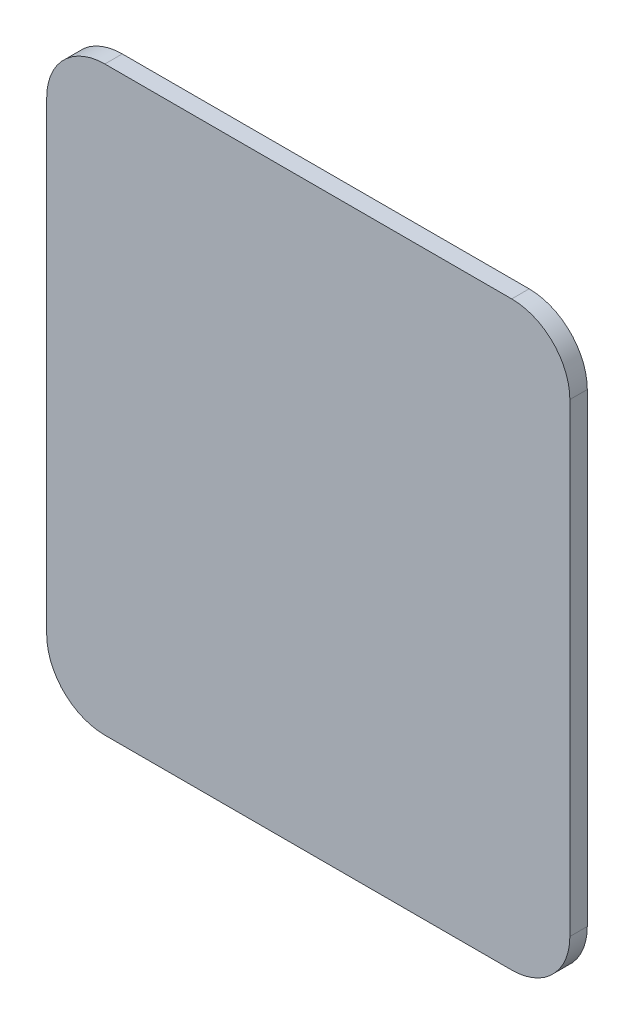
ISO-10303-21;
HEADER;
FILE_DESCRIPTION(('STEP AP214'),'2;1');
FILE_NAME('part.step','',(''),(''),'','','');
FILE_SCHEMA(('AUTOMOTIVE_DESIGN { 1 0 10303 214 1 1 1 1 }'));
ENDSEC;
DATA;
#1=APPLICATION_CONTEXT('core data for automotive mechanical design processes');
#2=APPLICATION_PROTOCOL_DEFINITION('international standard','automotive_design',2000,#1);
#3=PRODUCT_CONTEXT('',#1,'mechanical');
#4=PRODUCT('Part','Part','',(#3));
#5=PRODUCT_RELATED_PRODUCT_CATEGORY('part','',(#4));
#6=PRODUCT_DEFINITION_FORMATION('','',#4);
#7=PRODUCT_DEFINITION_CONTEXT('part definition',#1,'design');
#8=PRODUCT_DEFINITION('design','',#6,#7);
#9=PRODUCT_DEFINITION_SHAPE('','',#8);
#10=(LENGTH_UNIT() NAMED_UNIT(*) SI_UNIT(.MILLI.,.METRE.));
#11=(NAMED_UNIT(*) PLANE_ANGLE_UNIT() SI_UNIT($,.RADIAN.));
#12=(NAMED_UNIT(*) SI_UNIT($,.STERADIAN.) SOLID_ANGLE_UNIT());
#13=UNCERTAINTY_MEASURE_WITH_UNIT(LENGTH_MEASURE(1.E-05),#10,'distance_accuracy_value','');
#14=(GEOMETRIC_REPRESENTATION_CONTEXT(3) GLOBAL_UNCERTAINTY_ASSIGNED_CONTEXT((#13)) GLOBAL_UNIT_ASSIGNED_CONTEXT((#10,
#11,#12)) REPRESENTATION_CONTEXT('',''));
#15=CARTESIAN_POINT('',(0.,0.,0.));
#16=DIRECTION('',(0.,0.,1.));
#17=DIRECTION('',(1.,0.,0.));
#18=AXIS2_PLACEMENT_3D('',#15,#16,#17);
#19=CARTESIAN_POINT('',(53.2129195112654,-70.3373762207558,3.));
#20=DIRECTION('',(0.,0.,1.));
#21=DIRECTION('',(1.,0.,0.));
#22=AXIS2_PLACEMENT_3D('',#19,#20,#21);
#23=CYLINDRICAL_SURFACE('',#22,10.);
#24=DIRECTION('',(0.,0.,1.));
#25=VECTOR('',#24,1.);
#26=CARTESIAN_POINT('',(53.2129195112654,-80.3373762207558,3.));
#27=LINE('',#26,#25);
#28=CARTESIAN_POINT('',(53.2129195112654,-80.3373762207558,0.));
#29=VERTEX_POINT('',#28);
#30=CARTESIAN_POINT('',(53.2129195112654,-80.3373762207558,3.));
#31=VERTEX_POINT('',#30);
#32=EDGE_CURVE('E150',#29,#31,#27,.T.);
#33=ORIENTED_EDGE('',*,*,#32,.F.);
#34=CARTESIAN_POINT('',(53.2129195112654,-70.3373762207558,0.));
#35=DIRECTION('',(0.,0.,1.));
#36=DIRECTION('',(1.,0.,0.));
#37=AXIS2_PLACEMENT_3D('',#34,#35,#36);
#38=CIRCLE('',#37,10.);
#39=CARTESIAN_POINT('',(63.2129195112654,-70.3373762207558,0.));
#40=VERTEX_POINT('',#39);
#41=EDGE_CURVE('E40',#40,#29,#38,.F.);
#42=ORIENTED_EDGE('',*,*,#41,.F.);
#43=DIRECTION('',(0.,0.,1.));
#44=VECTOR('',#43,1.);
#45=CARTESIAN_POINT('',(63.2129195112654,-70.3373762207558,3.));
#46=LINE('',#45,#44);
#47=CARTESIAN_POINT('',(63.2129195112654,-70.3373762207558,3.));
#48=VERTEX_POINT('',#47);
#49=EDGE_CURVE('E153',#48,#40,#46,.F.);
#50=ORIENTED_EDGE('',*,*,#49,.F.);
#51=CARTESIAN_POINT('',(53.2129195112654,-70.3373762207558,3.));
#52=DIRECTION('',(0.,0.,1.));
#53=DIRECTION('',(1.,0.,0.));
#54=AXIS2_PLACEMENT_3D('',#51,#52,#53);
#55=CIRCLE('',#54,10.);
#56=EDGE_CURVE('E11',#31,#48,#55,.T.);
#57=ORIENTED_EDGE('',*,*,#56,.F.);
#58=EDGE_LOOP('',(#33,#42,#50,#57));
#59=FACE_BOUND('',#58,.T.);
#60=ADVANCED_FACE('F33',(#59),#23,.T.);
#61=CARTESIAN_POINT('',(-16.7870804887346,-70.3373762207558,3.));
#62=DIRECTION('',(0.,0.,1.));
#63=DIRECTION('',(1.,0.,0.));
#64=AXIS2_PLACEMENT_3D('',#61,#62,#63);
#65=CYLINDRICAL_SURFACE('',#64,10.);
#66=DIRECTION('',(0.,0.,1.));
#67=VECTOR('',#66,1.);
#68=CARTESIAN_POINT('',(-26.7870804887346,-70.3373762207558,3.));
#69=LINE('',#68,#67);
#70=CARTESIAN_POINT('',(-26.7870804887346,-70.3373762207558,0.));
#71=VERTEX_POINT('',#70);
#72=CARTESIAN_POINT('',(-26.7870804887346,-70.3373762207558,3.));
#73=VERTEX_POINT('',#72);
#74=EDGE_CURVE('E140',#71,#73,#69,.T.);
#75=ORIENTED_EDGE('',*,*,#74,.F.);
#76=CARTESIAN_POINT('',(-16.7870804887346,-70.3373762207558,0.));
#77=DIRECTION('',(0.,0.,1.));
#78=DIRECTION('',(1.,0.,0.));
#79=AXIS2_PLACEMENT_3D('',#76,#77,#78);
#80=CIRCLE('',#79,10.);
#81=CARTESIAN_POINT('',(-16.7870804887346,-80.3373762207558,0.));
#82=VERTEX_POINT('',#81);
#83=EDGE_CURVE('E146',#82,#71,#80,.F.);
#84=ORIENTED_EDGE('',*,*,#83,.F.);
#85=DIRECTION('',(0.,0.,1.));
#86=VECTOR('',#85,1.);
#87=CARTESIAN_POINT('',(-16.7870804887346,-80.3373762207558,3.));
#88=LINE('',#87,#86);
#89=CARTESIAN_POINT('',(-16.7870804887346,-80.3373762207558,3.));
#90=VERTEX_POINT('',#89);
#91=EDGE_CURVE('E143',#90,#82,#88,.F.);
#92=ORIENTED_EDGE('',*,*,#91,.F.);
#93=CARTESIAN_POINT('',(-16.7870804887346,-70.3373762207558,3.));
#94=DIRECTION('',(0.,0.,1.));
#95=DIRECTION('',(1.,0.,0.));
#96=AXIS2_PLACEMENT_3D('',#93,#94,#95);
#97=CIRCLE('',#96,10.);
#98=EDGE_CURVE('E148',#73,#90,#97,.T.);
#99=ORIENTED_EDGE('',*,*,#98,.F.);
#100=EDGE_LOOP('',(#75,#84,#92,#99));
#101=FACE_BOUND('',#100,.T.);
#102=ADVANCED_FACE('F171',(#101),#65,.T.);
#103=CARTESIAN_POINT('',(-16.7870804887346,9.66262377924419,3.));
#104=DIRECTION('',(0.,0.,1.));
#105=DIRECTION('',(1.,0.,0.));
#106=AXIS2_PLACEMENT_3D('',#103,#104,#105);
#107=CYLINDRICAL_SURFACE('',#106,10.);
#108=DIRECTION('',(0.,0.,1.));
#109=VECTOR('',#108,1.);
#110=CARTESIAN_POINT('',(-16.7870804887346,19.6626237792442,3.));
#111=LINE('',#110,#109);
#112=CARTESIAN_POINT('',(-16.7870804887346,19.6626237792442,0.));
#113=VERTEX_POINT('',#112);
#114=CARTESIAN_POINT('',(-16.7870804887346,19.6626237792442,3.));
#115=VERTEX_POINT('',#114);
#116=EDGE_CURVE('E106',#113,#115,#111,.T.);
#117=ORIENTED_EDGE('',*,*,#116,.F.);
#118=CARTESIAN_POINT('',(-16.7870804887346,9.66262377924419,0.));
#119=DIRECTION('',(0.,0.,1.));
#120=DIRECTION('',(1.,0.,0.));
#121=AXIS2_PLACEMENT_3D('',#118,#119,#120);
#122=CIRCLE('',#121,10.);
#123=CARTESIAN_POINT('',(-26.7870804887346,9.66262377924419,0.));
#124=VERTEX_POINT('',#123);
#125=EDGE_CURVE('E119',#124,#113,#122,.F.);
#126=ORIENTED_EDGE('',*,*,#125,.F.);
#127=DIRECTION('',(0.,0.,1.));
#128=VECTOR('',#127,1.);
#129=CARTESIAN_POINT('',(-26.7870804887346,9.66262377924419,3.));
#130=LINE('',#129,#128);
#131=CARTESIAN_POINT('',(-26.7870804887346,9.66262377924419,3.));
#132=VERTEX_POINT('',#131);
#133=EDGE_CURVE('E134',#132,#124,#130,.F.);
#134=ORIENTED_EDGE('',*,*,#133,.F.);
#135=CARTESIAN_POINT('',(-16.7870804887346,9.66262377924419,3.));
#136=DIRECTION('',(0.,0.,1.));
#137=DIRECTION('',(1.,0.,0.));
#138=AXIS2_PLACEMENT_3D('',#135,#136,#137);
#139=CIRCLE('',#138,10.);
#140=EDGE_CURVE('E138',#115,#132,#139,.T.);
#141=ORIENTED_EDGE('',*,*,#140,.F.);
#142=EDGE_LOOP('',(#117,#126,#134,#141));
#143=FACE_BOUND('',#142,.T.);
#144=ADVANCED_FACE('F176',(#143),#107,.T.);
#145=CARTESIAN_POINT('',(53.2129195112654,9.66262377924419,3.));
#146=DIRECTION('',(0.,0.,-1.));
#147=DIRECTION('',(-1.,0.,0.));
#148=AXIS2_PLACEMENT_3D('',#145,#146,#147);
#149=CYLINDRICAL_SURFACE('',#148,10.);
#150=DIRECTION('',(0.,0.,-1.));
#151=VECTOR('',#150,1.);
#152=CARTESIAN_POINT('',(53.2129195112654,19.6626237792442,3.));
#153=LINE('',#152,#151);
#154=CARTESIAN_POINT('',(53.2129195112654,19.6626237792442,3.));
#155=VERTEX_POINT('',#154);
#156=CARTESIAN_POINT('',(53.2129195112654,19.6626237792442,0.));
#157=VERTEX_POINT('',#156);
#158=EDGE_CURVE('E99',#155,#157,#153,.T.);
#159=ORIENTED_EDGE('',*,*,#158,.F.);
#160=CARTESIAN_POINT('',(53.2129195112654,9.66262377924419,3.));
#161=DIRECTION('',(0.,0.,1.));
#162=DIRECTION('',(1.,0.,0.));
#163=AXIS2_PLACEMENT_3D('',#160,#161,#162);
#164=CIRCLE('',#163,10.);
#165=CARTESIAN_POINT('',(63.2129195112654,9.66262377924419,3.));
#166=VERTEX_POINT('',#165);
#167=EDGE_CURVE('E107',#166,#155,#164,.T.);
#168=ORIENTED_EDGE('',*,*,#167,.F.);
#169=DIRECTION('',(0.,0.,-1.));
#170=VECTOR('',#169,1.);
#171=CARTESIAN_POINT('',(63.2129195112654,9.66262377924419,3.));
#172=LINE('',#171,#170);
#173=CARTESIAN_POINT('',(63.2129195112654,9.66262377924419,0.));
#174=VERTEX_POINT('',#173);
#175=EDGE_CURVE('E102',#174,#166,#172,.F.);
#176=ORIENTED_EDGE('',*,*,#175,.F.);
#177=CARTESIAN_POINT('',(53.2129195112654,9.66262377924419,0.));
#178=DIRECTION('',(0.,0.,1.));
#179=DIRECTION('',(1.,0.,0.));
#180=AXIS2_PLACEMENT_3D('',#177,#178,#179);
#181=CIRCLE('',#180,10.);
#182=EDGE_CURVE('E95',#157,#174,#181,.F.);
#183=ORIENTED_EDGE('',*,*,#182,.F.);
#184=EDGE_LOOP('',(#159,#168,#176,#183));
#185=FACE_BOUND('',#184,.T.);
#186=ADVANCED_FACE('F97',(#185),#149,.T.);
#187=CARTESIAN_POINT('',(-26.7870804887346,19.6626237792442,3.));
#188=DIRECTION('',(1.,0.,0.));
#189=DIRECTION('',(0.,1.,0.));
#190=AXIS2_PLACEMENT_3D('',#187,#188,#189);
#191=PLANE('',#190);
#192=DIRECTION('',(0.,-1.,0.));
#193=VECTOR('',#192,1.);
#194=CARTESIAN_POINT('',(-26.7870804887346,19.6626237792442,0.));
#195=LINE('',#194,#193);
#196=EDGE_CURVE('E160',#124,#71,#195,.T.);
#197=ORIENTED_EDGE('',*,*,#196,.T.);
#198=ORIENTED_EDGE('',*,*,#74,.T.);
#199=DIRECTION('',(0.,-1.,0.));
#200=VECTOR('',#199,1.);
#201=CARTESIAN_POINT('',(-26.7870804887346,19.6626237792442,3.));
#202=LINE('',#201,#200);
#203=EDGE_CURVE('E121',#132,#73,#202,.T.);
#204=ORIENTED_EDGE('',*,*,#203,.F.);
#205=ORIENTED_EDGE('',*,*,#133,.T.);
#206=EDGE_LOOP('',(#197,#198,#204,#205));
#207=FACE_BOUND('',#206,.T.);
#208=ADVANCED_FACE('F173',(#207),#191,.F.);
#209=CARTESIAN_POINT('',(-26.7870804887346,-80.3373762207558,3.));
#210=DIRECTION('',(0.,1.,0.));
#211=DIRECTION('',(0.,0.,1.));
#212=AXIS2_PLACEMENT_3D('',#209,#210,#211);
#213=PLANE('',#212);
#214=DIRECTION('',(1.,0.,0.));
#215=VECTOR('',#214,1.);
#216=CARTESIAN_POINT('',(-26.7870804887346,-80.3373762207558,0.));
#217=LINE('',#216,#215);
#218=EDGE_CURVE('E127',#82,#29,#217,.T.);
#219=ORIENTED_EDGE('',*,*,#218,.T.);
#220=ORIENTED_EDGE('',*,*,#32,.T.);
#221=DIRECTION('',(1.,0.,0.));
#222=VECTOR('',#221,1.);
#223=CARTESIAN_POINT('',(-26.7870804887346,-80.3373762207558,3.));
#224=LINE('',#223,#222);
#225=EDGE_CURVE('E125',#90,#31,#224,.T.);
#226=ORIENTED_EDGE('',*,*,#225,.F.);
#227=ORIENTED_EDGE('',*,*,#91,.T.);
#228=EDGE_LOOP('',(#219,#220,#226,#227));
#229=FACE_BOUND('',#228,.T.);
#230=ADVANCED_FACE('F158',(#229),#213,.F.);
#231=CARTESIAN_POINT('',(63.2129195112654,19.6626237792442,3.));
#232=DIRECTION('',(-1.,0.,0.));
#233=DIRECTION('',(0.,0.,1.));
#234=AXIS2_PLACEMENT_3D('',#231,#232,#233);
#235=PLANE('',#234);
#236=DIRECTION('',(0.,1.,0.));
#237=VECTOR('',#236,1.);
#238=CARTESIAN_POINT('',(63.2129195112654,19.6626237792442,3.));
#239=LINE('',#238,#237);
#240=EDGE_CURVE('E165',#48,#166,#239,.T.);
#241=ORIENTED_EDGE('',*,*,#240,.F.);
#242=ORIENTED_EDGE('',*,*,#49,.T.);
#243=DIRECTION('',(0.,1.,0.));
#244=VECTOR('',#243,1.);
#245=CARTESIAN_POINT('',(63.2129195112654,19.6626237792442,0.));
#246=LINE('',#245,#244);
#247=EDGE_CURVE('E122',#40,#174,#246,.T.);
#248=ORIENTED_EDGE('',*,*,#247,.T.);
#249=ORIENTED_EDGE('',*,*,#175,.T.);
#250=EDGE_LOOP('',(#241,#242,#248,#249));
#251=FACE_BOUND('',#250,.T.);
#252=ADVANCED_FACE('F179',(#251),#235,.F.);
#253=CARTESIAN_POINT('',(-26.7870804887346,19.6626237792442,3.));
#254=DIRECTION('',(0.,-1.,0.));
#255=DIRECTION('',(0.,0.,-1.));
#256=AXIS2_PLACEMENT_3D('',#253,#254,#255);
#257=PLANE('',#256);
#258=DIRECTION('',(-1.,0.,0.));
#259=VECTOR('',#258,1.);
#260=CARTESIAN_POINT('',(-26.7870804887346,19.6626237792442,0.));
#261=LINE('',#260,#259);
#262=EDGE_CURVE('E113',#157,#113,#261,.T.);
#263=ORIENTED_EDGE('',*,*,#262,.T.);
#264=ORIENTED_EDGE('',*,*,#116,.T.);
#265=DIRECTION('',(-1.,0.,0.));
#266=VECTOR('',#265,1.);
#267=CARTESIAN_POINT('',(-26.7870804887346,19.6626237792442,3.));
#268=LINE('',#267,#266);
#269=EDGE_CURVE('E115',#155,#115,#268,.T.);
#270=ORIENTED_EDGE('',*,*,#269,.F.);
#271=ORIENTED_EDGE('',*,*,#158,.T.);
#272=EDGE_LOOP('',(#263,#264,#270,#271));
#273=FACE_BOUND('',#272,.T.);
#274=ADVANCED_FACE('F111',(#273),#257,.F.);
#275=CARTESIAN_POINT('',(0.,0.,3.));
#276=DIRECTION('',(0.,0.,1.));
#277=DIRECTION('',(1.,0.,0.));
#278=AXIS2_PLACEMENT_3D('',#275,#276,#277);
#279=PLANE('',#278);
#280=ORIENTED_EDGE('',*,*,#225,.T.);
#281=ORIENTED_EDGE('',*,*,#56,.T.);
#282=ORIENTED_EDGE('',*,*,#240,.T.);
#283=ORIENTED_EDGE('',*,*,#167,.T.);
#284=ORIENTED_EDGE('',*,*,#269,.T.);
#285=ORIENTED_EDGE('',*,*,#140,.T.);
#286=ORIENTED_EDGE('',*,*,#203,.T.);
#287=ORIENTED_EDGE('',*,*,#98,.T.);
#288=EDGE_LOOP('',(#280,#281,#282,#283,#284,#285,#286,#287));
#289=FACE_BOUND('',#288,.T.);
#290=ADVANCED_FACE('F167',(#289),#279,.T.);
#291=CARTESIAN_POINT('',(0.,0.,0.));
#292=DIRECTION('',(0.,0.,1.));
#293=DIRECTION('',(1.,0.,0.));
#294=AXIS2_PLACEMENT_3D('',#291,#292,#293);
#295=PLANE('',#294);
#296=ORIENTED_EDGE('',*,*,#247,.F.);
#297=ORIENTED_EDGE('',*,*,#41,.T.);
#298=ORIENTED_EDGE('',*,*,#218,.F.);
#299=ORIENTED_EDGE('',*,*,#83,.T.);
#300=ORIENTED_EDGE('',*,*,#196,.F.);
#301=ORIENTED_EDGE('',*,*,#125,.T.);
#302=ORIENTED_EDGE('',*,*,#262,.F.);
#303=ORIENTED_EDGE('',*,*,#182,.T.);
#304=EDGE_LOOP('',(#296,#297,#298,#299,#300,#301,#302,#303));
#305=FACE_BOUND('',#304,.T.);
#306=ADVANCED_FACE('F117',(#305),#295,.F.);
#307=CLOSED_SHELL('',(#60,#102,#144,#186,#208,#230,#252,#274,#290,#306));
#308=MANIFOLD_SOLID_BREP('B2',#307);
#309=ADVANCED_BREP_SHAPE_REPRESENTATION('',(#18,#308),#14);
#310=SHAPE_DEFINITION_REPRESENTATION(#9,#309);
ENDSEC;
END-ISO-10303-21;
